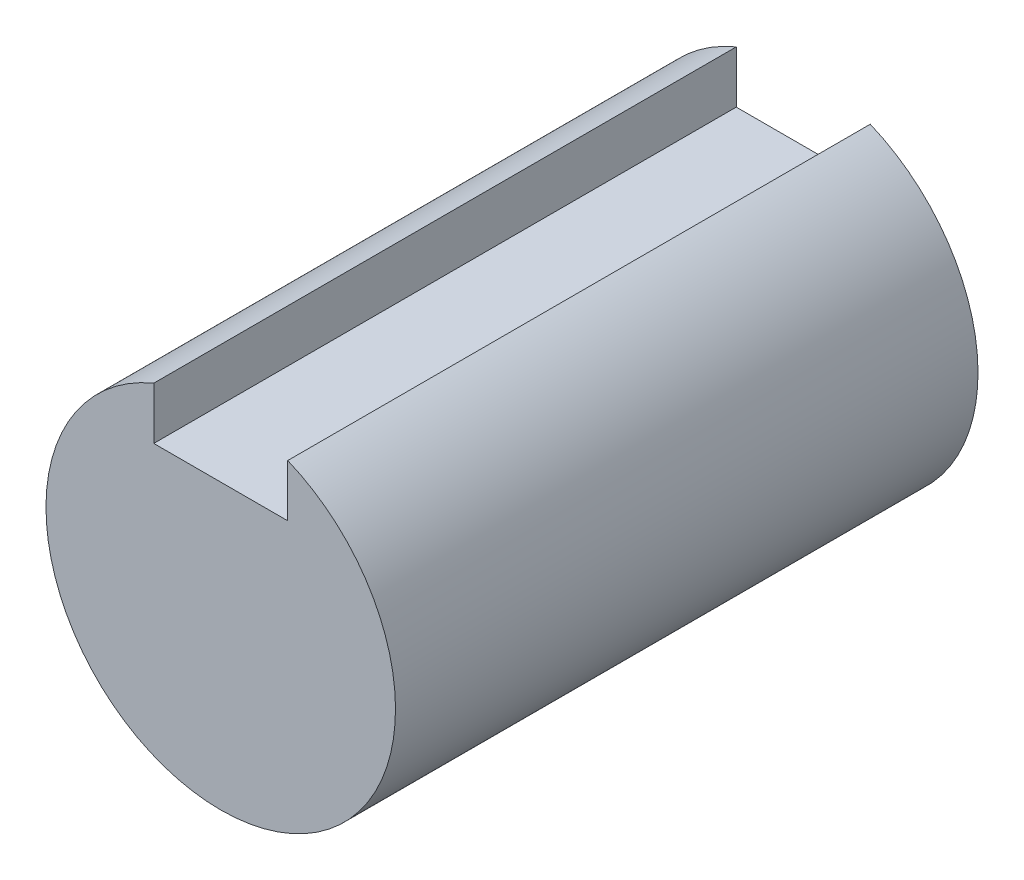
ISO-10303-21;
HEADER;
FILE_DESCRIPTION(('STEP AP214'),'2;1');
FILE_NAME('part.step','',(''),(''),'','','');
FILE_SCHEMA(('AUTOMOTIVE_DESIGN { 1 0 10303 214 1 1 1 1 }'));
ENDSEC;
DATA;
#1=APPLICATION_CONTEXT('core data for automotive mechanical design processes');
#2=APPLICATION_PROTOCOL_DEFINITION('international standard','automotive_design',2000,#1);
#3=PRODUCT_CONTEXT('',#1,'mechanical');
#4=PRODUCT('Part','Part','',(#3));
#5=PRODUCT_RELATED_PRODUCT_CATEGORY('part','',(#4));
#6=PRODUCT_DEFINITION_FORMATION('','',#4);
#7=PRODUCT_DEFINITION_CONTEXT('part definition',#1,'design');
#8=PRODUCT_DEFINITION('design','',#6,#7);
#9=PRODUCT_DEFINITION_SHAPE('','',#8);
#10=(LENGTH_UNIT() NAMED_UNIT(*) SI_UNIT(.MILLI.,.METRE.));
#11=(NAMED_UNIT(*) PLANE_ANGLE_UNIT() SI_UNIT($,.RADIAN.));
#12=(NAMED_UNIT(*) SI_UNIT($,.STERADIAN.) SOLID_ANGLE_UNIT());
#13=UNCERTAINTY_MEASURE_WITH_UNIT(LENGTH_MEASURE(1.E-05),#10,'distance_accuracy_value','');
#14=(GEOMETRIC_REPRESENTATION_CONTEXT(3) GLOBAL_UNCERTAINTY_ASSIGNED_CONTEXT((#13)) GLOBAL_UNIT_ASSIGNED_CONTEXT((#10,
#11,#12)) REPRESENTATION_CONTEXT('',''));
#15=CARTESIAN_POINT('',(0.,0.,0.));
#16=DIRECTION('',(0.,0.,1.));
#17=DIRECTION('',(1.,0.,0.));
#18=AXIS2_PLACEMENT_3D('',#15,#16,#17);
#19=CARTESIAN_POINT('',(0.,0.,20.));
#20=DIRECTION('',(0.,0.,-1.));
#21=DIRECTION('',(0.,-1.,0.));
#22=AXIS2_PLACEMENT_3D('',#19,#20,#21);
#23=CYLINDRICAL_SURFACE('',#22,3.05);
#24=CARTESIAN_POINT('',(0.,0.,0.));
#25=DIRECTION('',(0.,0.,1.));
#26=DIRECTION('',(1.,0.,0.));
#27=AXIS2_PLACEMENT_3D('',#24,#25,#26);
#28=CIRCLE('',#27,3.05);
#29=CARTESIAN_POINT('',(3.05,0.,0.));
#30=VERTEX_POINT('',#29);
#31=EDGE_CURVE('E66',#30,#30,#28,.T.);
#32=ORIENTED_EDGE('',*,*,#31,.F.);
#33=EDGE_LOOP('',(#32));
#34=FACE_BOUND('',#33,.T.);
#35=CARTESIAN_POINT('',(0.,0.,17.));
#36=DIRECTION('',(0.,0.,1.));
#37=DIRECTION('',(1.,0.,0.));
#38=AXIS2_PLACEMENT_3D('',#35,#36,#37);
#39=CIRCLE('',#38,3.05);
#40=CARTESIAN_POINT('',(3.05,0.,17.));
#41=VERTEX_POINT('',#40);
#42=EDGE_CURVE('E9',#41,#41,#39,.T.);
#43=ORIENTED_EDGE('',*,*,#42,.T.);
#44=EDGE_LOOP('',(#43));
#45=FACE_BOUND('',#44,.T.);
#46=ADVANCED_FACE('F15',(#34,#45),#23,.F.);
#47=CARTESIAN_POINT('',(0.,0.,20.));
#48=DIRECTION('',(0.,0.,1.));
#49=DIRECTION('',(1.,0.,0.));
#50=AXIS2_PLACEMENT_3D('',#47,#48,#49);
#51=PLANE('',#50);
#52=DIRECTION('',(0.,1.,0.));
#53=VECTOR('',#52,1.);
#54=CARTESIAN_POINT('',(2.3,3.75,20.));
#55=LINE('',#54,#53);
#56=CARTESIAN_POINT('',(2.3,3.75,20.));
#57=VERTEX_POINT('',#56);
#58=CARTESIAN_POINT('',(2.3,5.54166040099896,20.));
#59=VERTEX_POINT('',#58);
#60=EDGE_CURVE('E82',#57,#59,#55,.T.);
#61=ORIENTED_EDGE('',*,*,#60,.F.);
#62=DIRECTION('',(1.,0.,0.));
#63=VECTOR('',#62,1.);
#64=CARTESIAN_POINT('',(-2.3,3.75,20.));
#65=LINE('',#64,#63);
#66=CARTESIAN_POINT('',(-2.3,3.75,20.));
#67=VERTEX_POINT('',#66);
#68=EDGE_CURVE('E34',#67,#57,#65,.T.);
#69=ORIENTED_EDGE('',*,*,#68,.F.);
#70=DIRECTION('',(0.,-1.,0.));
#71=VECTOR('',#70,1.);
#72=CARTESIAN_POINT('',(-2.3,5.54166040099896,20.));
#73=LINE('',#72,#71);
#74=CARTESIAN_POINT('',(-2.3,5.54166040099896,20.));
#75=VERTEX_POINT('',#74);
#76=EDGE_CURVE('E88',#75,#67,#73,.T.);
#77=ORIENTED_EDGE('',*,*,#76,.F.);
#78=CARTESIAN_POINT('',(0.,0.,20.));
#79=DIRECTION('',(0.,0.,1.));
#80=DIRECTION('',(1.,0.,0.));
#81=AXIS2_PLACEMENT_3D('',#78,#79,#80);
#82=CIRCLE('',#81,6.);
#83=EDGE_CURVE('E25',#75,#59,#82,.T.);
#84=ORIENTED_EDGE('',*,*,#83,.T.);
#85=EDGE_LOOP('',(#61,#69,#77,#84));
#86=FACE_BOUND('',#85,.T.);
#87=ADVANCED_FACE('F97',(#86),#51,.T.);
#88=CARTESIAN_POINT('',(0.,0.,0.));
#89=DIRECTION('',(0.,0.,1.));
#90=DIRECTION('',(1.,0.,0.));
#91=AXIS2_PLACEMENT_3D('',#88,#89,#90);
#92=PLANE('',#91);
#93=DIRECTION('',(1.,0.,0.));
#94=VECTOR('',#93,1.);
#95=CARTESIAN_POINT('',(-2.3,3.75,0.));
#96=LINE('',#95,#94);
#97=CARTESIAN_POINT('',(-2.3,3.75,0.));
#98=VERTEX_POINT('',#97);
#99=CARTESIAN_POINT('',(2.3,3.75,0.));
#100=VERTEX_POINT('',#99);
#101=EDGE_CURVE('E85',#98,#100,#96,.T.);
#102=ORIENTED_EDGE('',*,*,#101,.T.);
#103=DIRECTION('',(0.,1.,0.));
#104=VECTOR('',#103,1.);
#105=CARTESIAN_POINT('',(2.3,3.75,0.));
#106=LINE('',#105,#104);
#107=CARTESIAN_POINT('',(2.3,5.54166040099896,0.));
#108=VERTEX_POINT('',#107);
#109=EDGE_CURVE('E64',#100,#108,#106,.T.);
#110=ORIENTED_EDGE('',*,*,#109,.T.);
#111=CARTESIAN_POINT('',(0.,0.,0.));
#112=DIRECTION('',(0.,0.,1.));
#113=DIRECTION('',(1.,0.,0.));
#114=AXIS2_PLACEMENT_3D('',#111,#112,#113);
#115=CIRCLE('',#114,6.);
#116=CARTESIAN_POINT('',(-2.3,5.54166040099896,0.));
#117=VERTEX_POINT('',#116);
#118=EDGE_CURVE('E55',#117,#108,#115,.T.);
#119=ORIENTED_EDGE('',*,*,#118,.F.);
#120=DIRECTION('',(0.,-1.,0.));
#121=VECTOR('',#120,1.);
#122=CARTESIAN_POINT('',(-2.3,5.54166040099896,0.));
#123=LINE('',#122,#121);
#124=EDGE_CURVE('E62',#117,#98,#123,.T.);
#125=ORIENTED_EDGE('',*,*,#124,.T.);
#126=EDGE_LOOP('',(#102,#110,#119,#125));
#127=FACE_BOUND('',#126,.T.);
#128=ORIENTED_EDGE('',*,*,#31,.T.);
#129=EDGE_LOOP('',(#128));
#130=FACE_BOUND('',#129,.T.);
#131=ADVANCED_FACE('F60',(#127,#130),#92,.F.);
#132=CARTESIAN_POINT('',(0.,0.,20.));
#133=DIRECTION('',(0.,0.,-1.));
#134=DIRECTION('',(0.,-1.,0.));
#135=AXIS2_PLACEMENT_3D('',#132,#133,#134);
#136=CYLINDRICAL_SURFACE('',#135,6.);
#137=ORIENTED_EDGE('',*,*,#118,.T.);
#138=DIRECTION('',(0.,0.,1.));
#139=VECTOR('',#138,1.);
#140=CARTESIAN_POINT('',(2.3,5.54166040099896,20.));
#141=LINE('',#140,#139);
#142=EDGE_CURVE('E67',#108,#59,#141,.T.);
#143=ORIENTED_EDGE('',*,*,#142,.T.);
#144=ORIENTED_EDGE('',*,*,#83,.F.);
#145=DIRECTION('',(0.,0.,-1.));
#146=VECTOR('',#145,1.);
#147=CARTESIAN_POINT('',(-2.3,5.54166040099896,20.));
#148=LINE('',#147,#146);
#149=EDGE_CURVE('E74',#75,#117,#148,.T.);
#150=ORIENTED_EDGE('',*,*,#149,.T.);
#151=EDGE_LOOP('',(#137,#143,#144,#150));
#152=FACE_BOUND('',#151,.T.);
#153=ADVANCED_FACE('F17',(#152),#136,.T.);
#154=CARTESIAN_POINT('',(2.3,6.29316109321346,0.));
#155=DIRECTION('',(1.,0.,0.));
#156=DIRECTION('',(0.,0.,-1.));
#157=AXIS2_PLACEMENT_3D('',#154,#155,#156);
#158=PLANE('',#157);
#159=ORIENTED_EDGE('',*,*,#109,.F.);
#160=DIRECTION('',(0.,0.,1.));
#161=VECTOR('',#160,1.);
#162=CARTESIAN_POINT('',(2.3,3.75,0.));
#163=LINE('',#162,#161);
#164=EDGE_CURVE('E78',#100,#57,#163,.T.);
#165=ORIENTED_EDGE('',*,*,#164,.T.);
#166=ORIENTED_EDGE('',*,*,#60,.T.);
#167=ORIENTED_EDGE('',*,*,#142,.F.);
#168=EDGE_LOOP('',(#159,#165,#166,#167));
#169=FACE_BOUND('',#168,.T.);
#170=ADVANCED_FACE('F112',(#169),#158,.F.);
#171=CARTESIAN_POINT('',(-2.3,6.29316109321346,0.));
#172=DIRECTION('',(-1.,0.,0.));
#173=DIRECTION('',(0.,0.,1.));
#174=AXIS2_PLACEMENT_3D('',#171,#172,#173);
#175=PLANE('',#174);
#176=ORIENTED_EDGE('',*,*,#76,.T.);
#177=DIRECTION('',(0.,0.,1.));
#178=VECTOR('',#177,1.);
#179=CARTESIAN_POINT('',(-2.3,3.75,0.));
#180=LINE('',#179,#178);
#181=EDGE_CURVE('E19',#98,#67,#180,.T.);
#182=ORIENTED_EDGE('',*,*,#181,.F.);
#183=ORIENTED_EDGE('',*,*,#124,.F.);
#184=ORIENTED_EDGE('',*,*,#149,.F.);
#185=EDGE_LOOP('',(#176,#182,#183,#184));
#186=FACE_BOUND('',#185,.T.);
#187=ADVANCED_FACE('F73',(#186),#175,.F.);
#188=CARTESIAN_POINT('',(2.3,3.75,0.));
#189=DIRECTION('',(0.,-1.,0.));
#190=DIRECTION('',(1.,0.,0.));
#191=AXIS2_PLACEMENT_3D('',#188,#189,#190);
#192=PLANE('',#191);
#193=ORIENTED_EDGE('',*,*,#68,.T.);
#194=ORIENTED_EDGE('',*,*,#164,.F.);
#195=ORIENTED_EDGE('',*,*,#101,.F.);
#196=ORIENTED_EDGE('',*,*,#181,.T.);
#197=EDGE_LOOP('',(#193,#194,#195,#196));
#198=FACE_BOUND('',#197,.T.);
#199=ADVANCED_FACE('F102',(#198),#192,.F.);
#200=CARTESIAN_POINT('',(0.,0.,17.));
#201=DIRECTION('',(0.,0.,1.));
#202=DIRECTION('',(1.,0.,0.));
#203=AXIS2_PLACEMENT_3D('',#200,#201,#202);
#204=PLANE('',#203);
#205=ORIENTED_EDGE('',*,*,#42,.F.);
#206=EDGE_LOOP('',(#205));
#207=FACE_BOUND('',#206,.T.);
#208=ADVANCED_FACE('F100',(#207),#204,.F.);
#209=CLOSED_SHELL('',(#46,#87,#131,#153,#170,#187,#199,#208));
#210=MANIFOLD_SOLID_BREP('B1',#209);
#211=ADVANCED_BREP_SHAPE_REPRESENTATION('',(#18,#210),#14);
#212=SHAPE_DEFINITION_REPRESENTATION(#9,#211);
ENDSEC;
END-ISO-10303-21;
